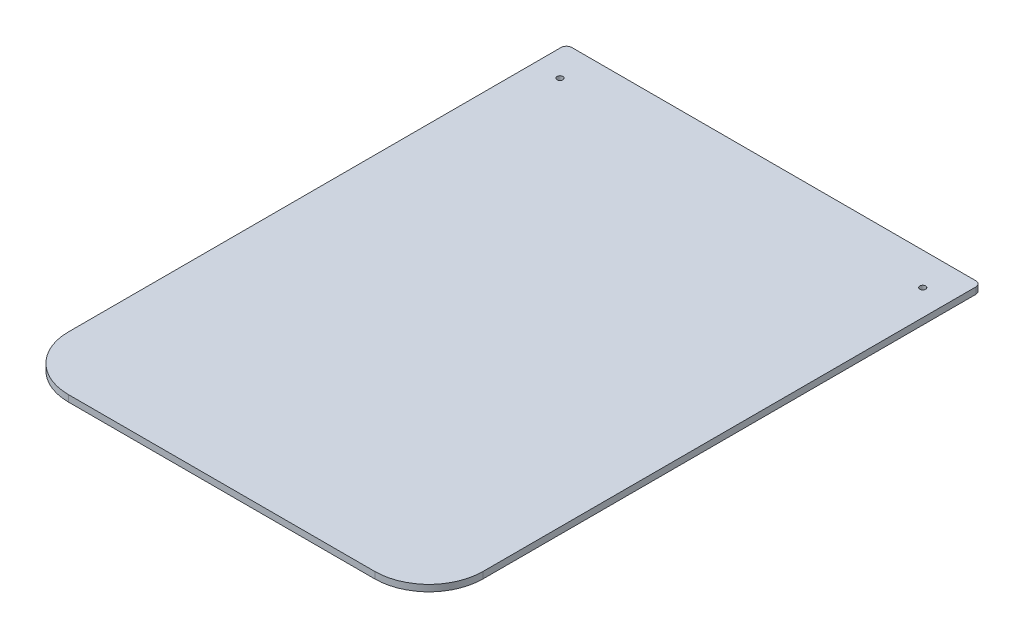
ISO-10303-21;
HEADER;
FILE_DESCRIPTION(('STEP AP214'),'2;1');
FILE_NAME('part.step','',(''),(''),'','','');
FILE_SCHEMA(('AUTOMOTIVE_DESIGN { 1 0 10303 214 1 1 1 1 }'));
ENDSEC;
DATA;
#1=APPLICATION_CONTEXT('core data for automotive mechanical design processes');
#2=APPLICATION_PROTOCOL_DEFINITION('international standard','automotive_design',2000,#1);
#3=PRODUCT_CONTEXT('',#1,'mechanical');
#4=PRODUCT('Part','Part','',(#3));
#5=PRODUCT_RELATED_PRODUCT_CATEGORY('part','',(#4));
#6=PRODUCT_DEFINITION_FORMATION('','',#4);
#7=PRODUCT_DEFINITION_CONTEXT('part definition',#1,'design');
#8=PRODUCT_DEFINITION('design','',#6,#7);
#9=PRODUCT_DEFINITION_SHAPE('','',#8);
#10=(LENGTH_UNIT() NAMED_UNIT(*) SI_UNIT(.MILLI.,.METRE.));
#11=(NAMED_UNIT(*) PLANE_ANGLE_UNIT() SI_UNIT($,.RADIAN.));
#12=(NAMED_UNIT(*) SI_UNIT($,.STERADIAN.) SOLID_ANGLE_UNIT());
#13=UNCERTAINTY_MEASURE_WITH_UNIT(LENGTH_MEASURE(1.E-05),#10,'distance_accuracy_value','');
#14=(GEOMETRIC_REPRESENTATION_CONTEXT(3) GLOBAL_UNCERTAINTY_ASSIGNED_CONTEXT((#13)) GLOBAL_UNIT_ASSIGNED_CONTEXT((#10,
#11,#12)) REPRESENTATION_CONTEXT('',''));
#15=CARTESIAN_POINT('',(0.,0.,0.));
#16=DIRECTION('',(0.,0.,1.));
#17=DIRECTION('',(1.,0.,0.));
#18=AXIS2_PLACEMENT_3D('',#15,#16,#17);
#19=CARTESIAN_POINT('',(191.5,6.,-255.));
#20=DIRECTION('',(-1.,0.,0.));
#21=DIRECTION('',(0.,0.,1.));
#22=AXIS2_PLACEMENT_3D('',#19,#20,#21);
#23=PLANE('',#22);
#24=DIRECTION('',(0.,0.,-1.));
#25=VECTOR('',#24,1.);
#26=CARTESIAN_POINT('',(191.5,0.,-255.));
#27=LINE('',#26,#25);
#28=CARTESIAN_POINT('',(191.5,0.,205.));
#29=VERTEX_POINT('',#28);
#30=CARTESIAN_POINT('',(191.5,0.,-250.));
#31=VERTEX_POINT('',#30);
#32=EDGE_CURVE('E213',#29,#31,#27,.T.);
#33=ORIENTED_EDGE('',*,*,#32,.T.);
#34=DIRECTION('',(0.,-1.,0.));
#35=VECTOR('',#34,1.);
#36=CARTESIAN_POINT('',(191.5,6.,-250.));
#37=LINE('',#36,#35);
#38=CARTESIAN_POINT('',(191.5,6.,-250.));
#39=VERTEX_POINT('',#38);
#40=EDGE_CURVE('E69',#31,#39,#37,.F.);
#41=ORIENTED_EDGE('',*,*,#40,.T.);
#42=DIRECTION('',(0.,0.,-1.));
#43=VECTOR('',#42,1.);
#44=CARTESIAN_POINT('',(191.5,6.,-255.));
#45=LINE('',#44,#43);
#46=CARTESIAN_POINT('',(191.5,6.,205.));
#47=VERTEX_POINT('',#46);
#48=EDGE_CURVE('E153',#47,#39,#45,.T.);
#49=ORIENTED_EDGE('',*,*,#48,.F.);
#50=DIRECTION('',(0.,-1.,0.));
#51=VECTOR('',#50,1.);
#52=CARTESIAN_POINT('',(191.5,6.,205.));
#53=LINE('',#52,#51);
#54=EDGE_CURVE('E178',#47,#29,#53,.T.);
#55=ORIENTED_EDGE('',*,*,#54,.T.);
#56=EDGE_LOOP('',(#33,#41,#49,#55));
#57=FACE_BOUND('',#56,.T.);
#58=ADVANCED_FACE('F39',(#57),#23,.F.);
#59=CARTESIAN_POINT('',(-191.5,6.,-255.));
#60=DIRECTION('',(0.,0.,1.));
#61=DIRECTION('',(1.,0.,0.));
#62=AXIS2_PLACEMENT_3D('',#59,#60,#61);
#63=PLANE('',#62);
#64=DIRECTION('',(-1.,0.,0.));
#65=VECTOR('',#64,1.);
#66=CARTESIAN_POINT('',(-191.5,6.,-255.));
#67=LINE('',#66,#65);
#68=CARTESIAN_POINT('',(186.5,6.,-255.));
#69=VERTEX_POINT('',#68);
#70=CARTESIAN_POINT('',(-186.5,6.,-255.));
#71=VERTEX_POINT('',#70);
#72=EDGE_CURVE('E159',#69,#71,#67,.T.);
#73=ORIENTED_EDGE('',*,*,#72,.F.);
#74=DIRECTION('',(0.,-1.,0.));
#75=VECTOR('',#74,1.);
#76=CARTESIAN_POINT('',(186.5,6.,-255.));
#77=LINE('',#76,#75);
#78=CARTESIAN_POINT('',(186.5,0.,-255.));
#79=VERTEX_POINT('',#78);
#80=EDGE_CURVE('E185',#69,#79,#77,.T.);
#81=ORIENTED_EDGE('',*,*,#80,.T.);
#82=DIRECTION('',(-1.,0.,0.));
#83=VECTOR('',#82,1.);
#84=CARTESIAN_POINT('',(-191.5,0.,-255.));
#85=LINE('',#84,#83);
#86=CARTESIAN_POINT('',(-186.5,0.,-255.));
#87=VERTEX_POINT('',#86);
#88=EDGE_CURVE('E162',#79,#87,#85,.T.);
#89=ORIENTED_EDGE('',*,*,#88,.T.);
#90=DIRECTION('',(0.,-1.,0.));
#91=VECTOR('',#90,1.);
#92=CARTESIAN_POINT('',(-186.5,6.,-255.));
#93=LINE('',#92,#91);
#94=EDGE_CURVE('E182',#87,#71,#93,.F.);
#95=ORIENTED_EDGE('',*,*,#94,.T.);
#96=EDGE_LOOP('',(#73,#81,#89,#95));
#97=FACE_BOUND('',#96,.T.);
#98=ADVANCED_FACE('F206',(#97),#63,.F.);
#99=CARTESIAN_POINT('',(-191.5,6.,-255.));
#100=DIRECTION('',(1.,0.,0.));
#101=DIRECTION('',(0.,0.,-1.));
#102=AXIS2_PLACEMENT_3D('',#99,#100,#101);
#103=PLANE('',#102);
#104=DIRECTION('',(0.,0.,1.));
#105=VECTOR('',#104,1.);
#106=CARTESIAN_POINT('',(-191.5,6.,-255.));
#107=LINE('',#106,#105);
#108=CARTESIAN_POINT('',(-191.5,6.,-250.));
#109=VERTEX_POINT('',#108);
#110=CARTESIAN_POINT('',(-191.5,6.,205.));
#111=VERTEX_POINT('',#110);
#112=EDGE_CURVE('E210',#109,#111,#107,.T.);
#113=ORIENTED_EDGE('',*,*,#112,.F.);
#114=DIRECTION('',(0.,-1.,0.));
#115=VECTOR('',#114,1.);
#116=CARTESIAN_POINT('',(-191.5,6.,-250.));
#117=LINE('',#116,#115);
#118=CARTESIAN_POINT('',(-191.5,0.,-250.));
#119=VERTEX_POINT('',#118);
#120=EDGE_CURVE('E11',#109,#119,#117,.T.);
#121=ORIENTED_EDGE('',*,*,#120,.T.);
#122=DIRECTION('',(0.,0.,1.));
#123=VECTOR('',#122,1.);
#124=CARTESIAN_POINT('',(-191.5,0.,-255.));
#125=LINE('',#124,#123);
#126=CARTESIAN_POINT('',(-191.5,0.,205.));
#127=VERTEX_POINT('',#126);
#128=EDGE_CURVE('E154',#119,#127,#125,.T.);
#129=ORIENTED_EDGE('',*,*,#128,.T.);
#130=DIRECTION('',(0.,-1.,0.));
#131=VECTOR('',#130,1.);
#132=CARTESIAN_POINT('',(-191.5,6.,205.));
#133=LINE('',#132,#131);
#134=EDGE_CURVE('E131',#127,#111,#133,.F.);
#135=ORIENTED_EDGE('',*,*,#134,.T.);
#136=EDGE_LOOP('',(#113,#121,#129,#135));
#137=FACE_BOUND('',#136,.T.);
#138=ADVANCED_FACE('F263',(#137),#103,.F.);
#139=CARTESIAN_POINT('',(-191.5,6.,255.));
#140=DIRECTION('',(0.,0.,-1.));
#141=DIRECTION('',(-1.,0.,0.));
#142=AXIS2_PLACEMENT_3D('',#139,#140,#141);
#143=PLANE('',#142);
#144=DIRECTION('',(1.,0.,0.));
#145=VECTOR('',#144,1.);
#146=CARTESIAN_POINT('',(-191.5,6.,255.));
#147=LINE('',#146,#145);
#148=CARTESIAN_POINT('',(-141.5,6.,255.));
#149=VERTEX_POINT('',#148);
#150=CARTESIAN_POINT('',(141.5,6.,255.));
#151=VERTEX_POINT('',#150);
#152=EDGE_CURVE('E145',#149,#151,#147,.T.);
#153=ORIENTED_EDGE('',*,*,#152,.F.);
#154=DIRECTION('',(0.,-1.,0.));
#155=VECTOR('',#154,1.);
#156=CARTESIAN_POINT('',(-141.5,6.,255.));
#157=LINE('',#156,#155);
#158=CARTESIAN_POINT('',(-141.5,0.,255.));
#159=VERTEX_POINT('',#158);
#160=EDGE_CURVE('E129',#149,#159,#157,.T.);
#161=ORIENTED_EDGE('',*,*,#160,.T.);
#162=DIRECTION('',(1.,0.,0.));
#163=VECTOR('',#162,1.);
#164=CARTESIAN_POINT('',(-191.5,0.,255.));
#165=LINE('',#164,#163);
#166=CARTESIAN_POINT('',(141.5,0.,255.));
#167=VERTEX_POINT('',#166);
#168=EDGE_CURVE('E142',#159,#167,#165,.T.);
#169=ORIENTED_EDGE('',*,*,#168,.T.);
#170=DIRECTION('',(0.,-1.,0.));
#171=VECTOR('',#170,1.);
#172=CARTESIAN_POINT('',(141.5,6.,255.));
#173=LINE('',#172,#171);
#174=EDGE_CURVE('E147',#167,#151,#173,.F.);
#175=ORIENTED_EDGE('',*,*,#174,.T.);
#176=EDGE_LOOP('',(#153,#161,#169,#175));
#177=FACE_BOUND('',#176,.T.);
#178=ADVANCED_FACE('F141',(#177),#143,.F.);
#179=CARTESIAN_POINT('',(0.,6.,0.));
#180=DIRECTION('',(0.,1.,0.));
#181=DIRECTION('',(0.,0.,1.));
#182=AXIS2_PLACEMENT_3D('',#179,#180,#181);
#183=PLANE('',#182);
#184=CARTESIAN_POINT('',(167.5,6.,-225.));
#185=DIRECTION('',(0.,-1.,0.));
#186=DIRECTION('',(0.,0.,-1.));
#187=AXIS2_PLACEMENT_3D('',#184,#185,#186);
#188=CIRCLE('',#187,2.70000000000001);
#189=CARTESIAN_POINT('',(167.5,6.,-227.7));
#190=VERTEX_POINT('',#189);
#191=EDGE_CURVE('E228',#190,#190,#188,.T.);
#192=ORIENTED_EDGE('',*,*,#191,.T.);
#193=EDGE_LOOP('',(#192));
#194=FACE_BOUND('',#193,.T.);
#195=CARTESIAN_POINT('',(-167.5,6.,-225.));
#196=DIRECTION('',(0.,-1.,0.));
#197=DIRECTION('',(0.,0.,-1.));
#198=AXIS2_PLACEMENT_3D('',#195,#196,#197);
#199=CIRCLE('',#198,2.70000000000001);
#200=CARTESIAN_POINT('',(-167.5,6.,-227.7));
#201=VERTEX_POINT('',#200);
#202=EDGE_CURVE('E216',#201,#201,#199,.T.);
#203=ORIENTED_EDGE('',*,*,#202,.T.);
#204=EDGE_LOOP('',(#203));
#205=FACE_BOUND('',#204,.T.);
#206=ORIENTED_EDGE('',*,*,#48,.T.);
#207=CARTESIAN_POINT('',(186.5,6.,-250.));
#208=DIRECTION('',(0.,1.,0.));
#209=DIRECTION('',(0.,0.,1.));
#210=AXIS2_PLACEMENT_3D('',#207,#208,#209);
#211=CIRCLE('',#210,5.);
#212=EDGE_CURVE('E48',#39,#69,#211,.T.);
#213=ORIENTED_EDGE('',*,*,#212,.T.);
#214=ORIENTED_EDGE('',*,*,#72,.T.);
#215=CARTESIAN_POINT('',(-186.5,6.,-250.));
#216=DIRECTION('',(0.,1.,0.));
#217=DIRECTION('',(0.,0.,1.));
#218=AXIS2_PLACEMENT_3D('',#215,#216,#217);
#219=CIRCLE('',#218,5.);
#220=EDGE_CURVE('E58',#71,#109,#219,.T.);
#221=ORIENTED_EDGE('',*,*,#220,.T.);
#222=ORIENTED_EDGE('',*,*,#112,.T.);
#223=CARTESIAN_POINT('',(-141.5,6.,205.));
#224=DIRECTION('',(0.,1.,0.));
#225=DIRECTION('',(0.,0.,1.));
#226=AXIS2_PLACEMENT_3D('',#223,#224,#225);
#227=CIRCLE('',#226,50.);
#228=EDGE_CURVE('E175',#111,#149,#227,.T.);
#229=ORIENTED_EDGE('',*,*,#228,.T.);
#230=ORIENTED_EDGE('',*,*,#152,.T.);
#231=CARTESIAN_POINT('',(141.5,6.,205.));
#232=DIRECTION('',(0.,1.,0.));
#233=DIRECTION('',(0.,0.,1.));
#234=AXIS2_PLACEMENT_3D('',#231,#232,#233);
#235=CIRCLE('',#234,50.);
#236=EDGE_CURVE('E172',#151,#47,#235,.T.);
#237=ORIENTED_EDGE('',*,*,#236,.T.);
#238=EDGE_LOOP('',(#206,#213,#214,#221,#222,#229,#230,#237));
#239=FACE_BOUND('',#238,.T.);
#240=ADVANCED_FACE('F202',(#194,#205,#239),#183,.T.);
#241=CARTESIAN_POINT('',(0.,0.,0.));
#242=DIRECTION('',(0.,1.,0.));
#243=DIRECTION('',(0.,0.,1.));
#244=AXIS2_PLACEMENT_3D('',#241,#242,#243);
#245=PLANE('',#244);
#246=CARTESIAN_POINT('',(167.5,0.,-225.));
#247=DIRECTION('',(0.,-1.,0.));
#248=DIRECTION('',(0.,0.,-1.));
#249=AXIS2_PLACEMENT_3D('',#246,#247,#248);
#250=CIRCLE('',#249,2.70000000000001);
#251=CARTESIAN_POINT('',(167.5,0.,-227.7));
#252=VERTEX_POINT('',#251);
#253=EDGE_CURVE('E230',#252,#252,#250,.T.);
#254=ORIENTED_EDGE('',*,*,#253,.F.);
#255=EDGE_LOOP('',(#254));
#256=FACE_BOUND('',#255,.T.);
#257=CARTESIAN_POINT('',(-167.5,0.,-225.));
#258=DIRECTION('',(0.,-1.,0.));
#259=DIRECTION('',(0.,0.,-1.));
#260=AXIS2_PLACEMENT_3D('',#257,#258,#259);
#261=CIRCLE('',#260,2.70000000000001);
#262=CARTESIAN_POINT('',(-167.5,0.,-227.7));
#263=VERTEX_POINT('',#262);
#264=EDGE_CURVE('E220',#263,#263,#261,.T.);
#265=ORIENTED_EDGE('',*,*,#264,.F.);
#266=EDGE_LOOP('',(#265));
#267=FACE_BOUND('',#266,.T.);
#268=ORIENTED_EDGE('',*,*,#88,.F.);
#269=CARTESIAN_POINT('',(186.5,0.,-250.));
#270=DIRECTION('',(0.,1.,0.));
#271=DIRECTION('',(0.,0.,1.));
#272=AXIS2_PLACEMENT_3D('',#269,#270,#271);
#273=CIRCLE('',#272,5.);
#274=EDGE_CURVE('E192',#79,#31,#273,.F.);
#275=ORIENTED_EDGE('',*,*,#274,.T.);
#276=ORIENTED_EDGE('',*,*,#32,.F.);
#277=CARTESIAN_POINT('',(141.5,0.,205.));
#278=DIRECTION('',(0.,1.,0.));
#279=DIRECTION('',(0.,0.,1.));
#280=AXIS2_PLACEMENT_3D('',#277,#278,#279);
#281=CIRCLE('',#280,50.);
#282=EDGE_CURVE('E136',#29,#167,#281,.F.);
#283=ORIENTED_EDGE('',*,*,#282,.T.);
#284=ORIENTED_EDGE('',*,*,#168,.F.);
#285=CARTESIAN_POINT('',(-141.5,0.,205.));
#286=DIRECTION('',(0.,1.,0.));
#287=DIRECTION('',(0.,0.,1.));
#288=AXIS2_PLACEMENT_3D('',#285,#286,#287);
#289=CIRCLE('',#288,50.);
#290=EDGE_CURVE('E125',#159,#127,#289,.F.);
#291=ORIENTED_EDGE('',*,*,#290,.T.);
#292=ORIENTED_EDGE('',*,*,#128,.F.);
#293=CARTESIAN_POINT('',(-186.5,0.,-250.));
#294=DIRECTION('',(0.,1.,0.));
#295=DIRECTION('',(0.,0.,1.));
#296=AXIS2_PLACEMENT_3D('',#293,#294,#295);
#297=CIRCLE('',#296,5.);
#298=EDGE_CURVE('E189',#119,#87,#297,.F.);
#299=ORIENTED_EDGE('',*,*,#298,.T.);
#300=EDGE_LOOP('',(#268,#275,#276,#283,#284,#291,#292,#299));
#301=FACE_BOUND('',#300,.T.);
#302=ADVANCED_FACE('F150',(#256,#267,#301),#245,.F.);
#303=CARTESIAN_POINT('',(-167.5,6.,-225.));
#304=DIRECTION('',(0.,-1.,0.));
#305=DIRECTION('',(0.,0.,-1.));
#306=AXIS2_PLACEMENT_3D('',#303,#304,#305);
#307=CYLINDRICAL_SURFACE('',#306,2.70000000000001);
#308=ORIENTED_EDGE('',*,*,#202,.F.);
#309=EDGE_LOOP('',(#308));
#310=FACE_BOUND('',#309,.T.);
#311=ORIENTED_EDGE('',*,*,#264,.T.);
#312=EDGE_LOOP('',(#311));
#313=FACE_BOUND('',#312,.T.);
#314=ADVANCED_FACE('F242',(#310,#313),#307,.F.);
#315=CARTESIAN_POINT('',(167.5,6.,-225.));
#316=DIRECTION('',(0.,-1.,0.));
#317=DIRECTION('',(0.,0.,-1.));
#318=AXIS2_PLACEMENT_3D('',#315,#316,#317);
#319=CYLINDRICAL_SURFACE('',#318,2.70000000000001);
#320=ORIENTED_EDGE('',*,*,#191,.F.);
#321=EDGE_LOOP('',(#320));
#322=FACE_BOUND('',#321,.T.);
#323=ORIENTED_EDGE('',*,*,#253,.T.);
#324=EDGE_LOOP('',(#323));
#325=FACE_BOUND('',#324,.T.);
#326=ADVANCED_FACE('F239',(#322,#325),#319,.F.);
#327=CARTESIAN_POINT('',(-141.5,6.,205.));
#328=DIRECTION('',(0.,-1.,0.));
#329=DIRECTION('',(0.,0.,-1.));
#330=AXIS2_PLACEMENT_3D('',#327,#328,#329);
#331=CYLINDRICAL_SURFACE('',#330,50.);
#332=ORIENTED_EDGE('',*,*,#228,.F.);
#333=ORIENTED_EDGE('',*,*,#134,.F.);
#334=ORIENTED_EDGE('',*,*,#290,.F.);
#335=ORIENTED_EDGE('',*,*,#160,.F.);
#336=EDGE_LOOP('',(#332,#333,#334,#335));
#337=FACE_BOUND('',#336,.T.);
#338=ADVANCED_FACE('F128',(#337),#331,.T.);
#339=CARTESIAN_POINT('',(141.5,6.,205.));
#340=DIRECTION('',(0.,-1.,0.));
#341=DIRECTION('',(0.,0.,-1.));
#342=AXIS2_PLACEMENT_3D('',#339,#340,#341);
#343=CYLINDRICAL_SURFACE('',#342,50.);
#344=ORIENTED_EDGE('',*,*,#236,.F.);
#345=ORIENTED_EDGE('',*,*,#174,.F.);
#346=ORIENTED_EDGE('',*,*,#282,.F.);
#347=ORIENTED_EDGE('',*,*,#54,.F.);
#348=EDGE_LOOP('',(#344,#345,#346,#347));
#349=FACE_BOUND('',#348,.T.);
#350=ADVANCED_FACE('F269',(#349),#343,.T.);
#351=CARTESIAN_POINT('',(186.5,6.,-250.));
#352=DIRECTION('',(0.,-1.,0.));
#353=DIRECTION('',(0.,0.,-1.));
#354=AXIS2_PLACEMENT_3D('',#351,#352,#353);
#355=CYLINDRICAL_SURFACE('',#354,5.);
#356=ORIENTED_EDGE('',*,*,#212,.F.);
#357=ORIENTED_EDGE('',*,*,#40,.F.);
#358=ORIENTED_EDGE('',*,*,#274,.F.);
#359=ORIENTED_EDGE('',*,*,#80,.F.);
#360=EDGE_LOOP('',(#356,#357,#358,#359));
#361=FACE_BOUND('',#360,.T.);
#362=ADVANCED_FACE('F212',(#361),#355,.T.);
#363=CARTESIAN_POINT('',(-186.5,6.,-250.));
#364=DIRECTION('',(0.,-1.,0.));
#365=DIRECTION('',(0.,0.,-1.));
#366=AXIS2_PLACEMENT_3D('',#363,#364,#365);
#367=CYLINDRICAL_SURFACE('',#366,5.);
#368=ORIENTED_EDGE('',*,*,#220,.F.);
#369=ORIENTED_EDGE('',*,*,#94,.F.);
#370=ORIENTED_EDGE('',*,*,#298,.F.);
#371=ORIENTED_EDGE('',*,*,#120,.F.);
#372=EDGE_LOOP('',(#368,#369,#370,#371));
#373=FACE_BOUND('',#372,.T.);
#374=ADVANCED_FACE('F41',(#373),#367,.T.);
#375=CLOSED_SHELL('',(#58,#98,#138,#178,#240,#302,#314,#326,#338,#350,#362,#374));
#376=MANIFOLD_SOLID_BREP('B2',#375);
#377=ADVANCED_BREP_SHAPE_REPRESENTATION('',(#18,#376),#14);
#378=SHAPE_DEFINITION_REPRESENTATION(#9,#377);
ENDSEC;
END-ISO-10303-21;
